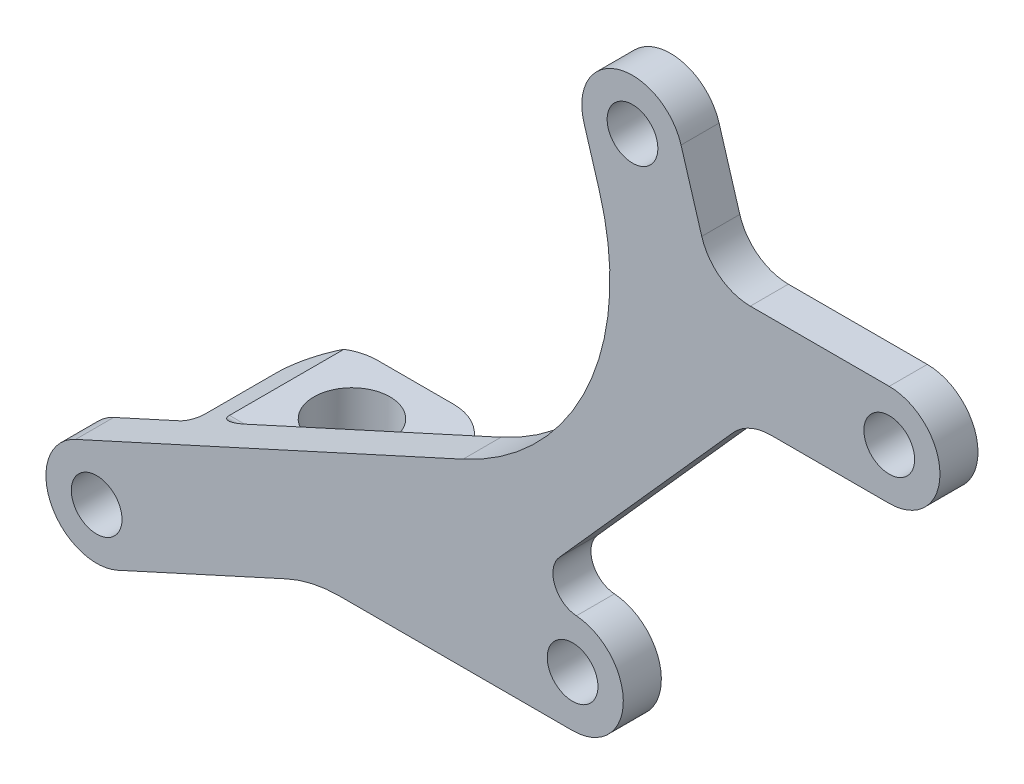
ISO-10303-21;
HEADER;
FILE_DESCRIPTION(('STEP AP214'),'2;1');
FILE_NAME('part.step','',(''),(''),'','','');
FILE_SCHEMA(('AUTOMOTIVE_DESIGN { 1 0 10303 214 1 1 1 1 }'));
ENDSEC;
DATA;
#1=APPLICATION_CONTEXT('core data for automotive mechanical design processes');
#2=APPLICATION_PROTOCOL_DEFINITION('international standard','automotive_design',2000,#1);
#3=PRODUCT_CONTEXT('',#1,'mechanical');
#4=PRODUCT('Part','Part','',(#3));
#5=PRODUCT_RELATED_PRODUCT_CATEGORY('part','',(#4));
#6=PRODUCT_DEFINITION_FORMATION('','',#4);
#7=PRODUCT_DEFINITION_CONTEXT('part definition',#1,'design');
#8=PRODUCT_DEFINITION('design','',#6,#7);
#9=PRODUCT_DEFINITION_SHAPE('','',#8);
#10=(LENGTH_UNIT() NAMED_UNIT(*) SI_UNIT(.MILLI.,.METRE.));
#11=(NAMED_UNIT(*) PLANE_ANGLE_UNIT() SI_UNIT($,.RADIAN.));
#12=(NAMED_UNIT(*) SI_UNIT($,.STERADIAN.) SOLID_ANGLE_UNIT());
#13=UNCERTAINTY_MEASURE_WITH_UNIT(LENGTH_MEASURE(1.E-05),#10,'distance_accuracy_value','');
#14=(GEOMETRIC_REPRESENTATION_CONTEXT(3) GLOBAL_UNCERTAINTY_ASSIGNED_CONTEXT((#13)) GLOBAL_UNIT_ASSIGNED_CONTEXT((#10,
#11,#12)) REPRESENTATION_CONTEXT('',''));
#15=CARTESIAN_POINT('',(0.,0.,0.));
#16=DIRECTION('',(0.,0.,1.));
#17=DIRECTION('',(1.,0.,0.));
#18=AXIS2_PLACEMENT_3D('',#15,#16,#17);
#19=CARTESIAN_POINT('',(15.9999999876103,2.00058899142973,0.));
#20=DIRECTION('',(0.,0.,1.));
#21=DIRECTION('',(1.,0.,0.));
#22=AXIS2_PLACEMENT_3D('',#19,#20,#21);
#23=PLANE('',#22);
#24=CARTESIAN_POINT('',(18.3627137863201,21.5612564415828,0.));
#25=DIRECTION('',(0.,0.,1.));
#26=DIRECTION('',(1.,0.,0.));
#27=AXIS2_PLACEMENT_3D('',#24,#25,#26);
#28=CIRCLE('',#27,1.);
#29=CARTESIAN_POINT('',(19.3627137863201,21.5612564415828,0.));
#30=VERTEX_POINT('',#29);
#31=EDGE_CURVE('E553',#30,#30,#28,.T.);
#32=ORIENTED_EDGE('',*,*,#31,.T.);
#33=EDGE_LOOP('',(#32));
#34=FACE_BOUND('',#33,.T.);
#35=CARTESIAN_POINT('',(15.9999999876103,2.00058899142973,0.));
#36=DIRECTION('',(0.,0.,1.));
#37=DIRECTION('',(1.,0.,0.));
#38=AXIS2_PLACEMENT_3D('',#35,#36,#37);
#39=CIRCLE('',#38,1.);
#40=CARTESIAN_POINT('',(16.9999999876103,2.00058899142973,0.));
#41=VERTEX_POINT('',#40);
#42=EDGE_CURVE('E557',#41,#41,#39,.T.);
#43=ORIENTED_EDGE('',*,*,#42,.T.);
#44=EDGE_LOOP('',(#43));
#45=FACE_BOUND('',#44,.T.);
#46=CARTESIAN_POINT('',(28.487225861294,16.0011779828595,0.));
#47=DIRECTION('',(0.,0.,1.));
#48=DIRECTION('',(1.,0.,0.));
#49=AXIS2_PLACEMENT_3D('',#46,#47,#48);
#50=CIRCLE('',#49,1.);
#51=CARTESIAN_POINT('',(29.487225861294,16.0011779828595,0.));
#52=VERTEX_POINT('',#51);
#53=EDGE_CURVE('E562',#52,#52,#50,.T.);
#54=ORIENTED_EDGE('',*,*,#53,.T.);
#55=EDGE_LOOP('',(#54));
#56=FACE_BOUND('',#55,.T.);
#57=DIRECTION('',(1.,0.,0.));
#58=VECTOR('',#57,1.);
#59=CARTESIAN_POINT('',(5.72587492170305,0.,0.));
#60=LINE('',#59,#58);
#61=CARTESIAN_POINT('',(8.49999998761032,0.,0.));
#62=VERTEX_POINT('',#61);
#63=CARTESIAN_POINT('',(15.9999999876103,0.,0.));
#64=VERTEX_POINT('',#63);
#65=EDGE_CURVE('E276',#62,#64,#60,.T.);
#66=ORIENTED_EDGE('',*,*,#65,.F.);
#67=DIRECTION('',(0.,-1.,0.));
#68=VECTOR('',#67,1.);
#69=CARTESIAN_POINT('',(8.49999998761032,2.5,0.));
#70=LINE('',#69,#68);
#71=CARTESIAN_POINT('',(8.49999998761032,2.5,0.));
#72=VERTEX_POINT('',#71);
#73=EDGE_CURVE('E354',#62,#72,#70,.F.);
#74=ORIENTED_EDGE('',*,*,#73,.T.);
#75=DIRECTION('',(1.,0.,0.));
#76=VECTOR('',#75,1.);
#77=CARTESIAN_POINT('',(0.468709119264436,2.5,0.));
#78=LINE('',#77,#76);
#79=CARTESIAN_POINT('',(1.56588374498278,2.5,0.));
#80=VERTEX_POINT('',#79);
#81=EDGE_CURVE('E339',#72,#80,#78,.F.);
#82=ORIENTED_EDGE('',*,*,#81,.T.);
#83=DIRECTION('',(-0.909964802315643,-0.414685493532933,0.));
#84=VECTOR('',#83,1.);
#85=CARTESIAN_POINT('',(-3.5973418353976,0.147035640748656,0.));
#86=LINE('',#85,#84);
#87=CARTESIAN_POINT('',(11.678911431911,7.10866823287454,0.));
#88=VERTEX_POINT('',#87);
#89=EDGE_CURVE('E281',#88,#80,#86,.T.);
#90=ORIENTED_EDGE('',*,*,#89,.F.);
#91=CARTESIAN_POINT('',(7.57352504593501,16.1173197757994,0.));
#92=DIRECTION('',(0.,0.,-1.));
#93=DIRECTION('',(1.,0.,0.));
#94=AXIS2_PLACEMENT_3D('',#91,#92,#93);
#95=CIRCLE('',#94,9.9);
#96=CARTESIAN_POINT('',(17.0539428486444,18.968929546801,0.));
#97=VERTEX_POINT('',#96);
#98=EDGE_CURVE('E508',#97,#88,#95,.T.);
#99=ORIENTED_EDGE('',*,*,#98,.F.);
#100=DIRECTION('',(0.288041391010258,-0.957617959869632,0.));
#101=VECTOR('',#100,1.);
#102=CARTESIAN_POINT('',(17.0539428486444,18.968929546801,0.));
#103=LINE('',#102,#101);
#104=CARTESIAN_POINT('',(16.4474778665809,20.9851736595623,0.));
#105=VERTEX_POINT('',#104);
#106=EDGE_CURVE('E506',#105,#97,#103,.T.);
#107=ORIENTED_EDGE('',*,*,#106,.F.);
#108=CARTESIAN_POINT('',(18.3627137863201,21.5612564415828,0.));
#109=DIRECTION('',(0.,0.,1.));
#110=DIRECTION('',(1.,0.,0.));
#111=AXIS2_PLACEMENT_3D('',#108,#109,#110);
#112=CIRCLE('',#111,2.);
#113=CARTESIAN_POINT('',(20.2779497060594,22.1373392236034,0.));
#114=VERTEX_POINT('',#113);
#115=EDGE_CURVE('E504',#114,#105,#112,.T.);
#116=ORIENTED_EDGE('',*,*,#115,.F.);
#117=DIRECTION('',(-0.288041391010258,0.957617959869632,0.));
#118=VECTOR('',#117,1.);
#119=CARTESIAN_POINT('',(20.2779497060594,22.1373392236034,0.));
#120=LINE('',#119,#118);
#121=CARTESIAN_POINT('',(21.093764126648,19.425095200839,0.));
#122=VERTEX_POINT('',#121);
#123=EDGE_CURVE('E502',#122,#114,#120,.T.);
#124=ORIENTED_EDGE('',*,*,#123,.F.);
#125=CARTESIAN_POINT('',(23.0090000463873,20.0011779828595,0.));
#126=DIRECTION('',(0.,0.,1.));
#127=DIRECTION('',(1.,0.,0.));
#128=AXIS2_PLACEMENT_3D('',#125,#126,#127);
#129=CIRCLE('',#128,2.);
#130=CARTESIAN_POINT('',(23.0090000463873,18.0011779828595,0.));
#131=VERTEX_POINT('',#130);
#132=EDGE_CURVE('E324',#122,#131,#129,.T.);
#133=ORIENTED_EDGE('',*,*,#132,.T.);
#134=DIRECTION('',(-1.,0.,0.));
#135=VECTOR('',#134,1.);
#136=CARTESIAN_POINT('',(28.487225861294,18.0011779828595,0.));
#137=LINE('',#136,#135);
#138=CARTESIAN_POINT('',(28.487225861294,18.0011779828595,0.));
#139=VERTEX_POINT('',#138);
#140=EDGE_CURVE('E499',#139,#131,#137,.T.);
#141=ORIENTED_EDGE('',*,*,#140,.F.);
#142=CARTESIAN_POINT('',(28.487225861294,16.0011779828595,0.));
#143=DIRECTION('',(0.,0.,1.));
#144=DIRECTION('',(1.,0.,0.));
#145=AXIS2_PLACEMENT_3D('',#142,#143,#144);
#146=CIRCLE('',#145,2.);
#147=CARTESIAN_POINT('',(28.487225861294,14.0011779828595,0.));
#148=VERTEX_POINT('',#147);
#149=EDGE_CURVE('E497',#148,#139,#146,.T.);
#150=ORIENTED_EDGE('',*,*,#149,.F.);
#151=DIRECTION('',(1.,0.,0.));
#152=VECTOR('',#151,1.);
#153=CARTESIAN_POINT('',(22.9190717043612,14.0011779828595,0.));
#154=LINE('',#153,#152);
#155=CARTESIAN_POINT('',(23.8151815342915,14.0011779828595,0.));
#156=VERTEX_POINT('',#155);
#157=EDGE_CURVE('E495',#156,#148,#154,.T.);
#158=ORIENTED_EDGE('',*,*,#157,.F.);
#159=CARTESIAN_POINT('',(23.8151815342915,12.0011779828595,0.));
#160=DIRECTION('',(0.,0.,1.));
#161=DIRECTION('',(1.,0.,0.));
#162=AXIS2_PLACEMENT_3D('',#159,#160,#161);
#163=CIRCLE('',#162,2.);
#164=CARTESIAN_POINT('',(22.3226020019824,13.3324203874319,0.));
#165=VERTEX_POINT('',#164);
#166=EDGE_CURVE('E319',#156,#165,#163,.T.);
#167=ORIENTED_EDGE('',*,*,#166,.T.);
#168=DIRECTION('',(0.66562120228622,0.746289766154572,0.));
#169=VECTOR('',#168,1.);
#170=CARTESIAN_POINT('',(13.9999998843631,4.00117798285946,0.));
#171=LINE('',#170,#169);
#172=CARTESIAN_POINT('',(15.4780865704061,5.65839828097267,0.));
#173=VERTEX_POINT('',#172);
#174=EDGE_CURVE('E492',#173,#165,#171,.T.);
#175=ORIENTED_EDGE('',*,*,#174,.F.);
#176=CARTESIAN_POINT('',(16.2243763365607,4.99277707868645,0.));
#177=DIRECTION('',(0.,0.,1.));
#178=DIRECTION('',(1.,0.,0.));
#179=AXIS2_PLACEMENT_3D('',#176,#177,#178);
#180=CIRCLE('',#179,1.);
#181=CARTESIAN_POINT('',(16.1495989013334,3.99557683040087,0.));
#182=VERTEX_POINT('',#181);
#183=EDGE_CURVE('E333',#173,#182,#180,.T.);
#184=ORIENTED_EDGE('',*,*,#183,.T.);
#185=CARTESIAN_POINT('',(15.9999999876103,2.00058899142973,0.));
#186=DIRECTION('',(0.,0.,1.));
#187=DIRECTION('',(1.,0.,0.));
#188=AXIS2_PLACEMENT_3D('',#185,#186,#187);
#189=CIRCLE('',#188,2.00058899142973);
#190=EDGE_CURVE('E489',#64,#182,#189,.T.);
#191=ORIENTED_EDGE('',*,*,#190,.F.);
#192=EDGE_LOOP('',(#66,#74,#82,#90,#99,#107,#116,#124,#133,#141,#150,#158,#167,#175,#184,#191));
#193=FACE_BOUND('',#192,.T.);
#194=ADVANCED_FACE('F33',(#34,#45,#56,#193),#23,.F.);
#195=CARTESIAN_POINT('',(-2.76797084833173,-1.67289396388264,0.));
#196=DIRECTION('',(0.,0.,1.));
#197=DIRECTION('',(1.,0.,0.));
#198=AXIS2_PLACEMENT_3D('',#195,#196,#197);
#199=CIRCLE('',#198,1.);
#200=CARTESIAN_POINT('',(-1.76797084833173,-1.67289396388264,0.));
#201=VERTEX_POINT('',#200);
#202=EDGE_CURVE('E568',#201,#201,#199,.T.);
#203=ORIENTED_EDGE('',*,*,#202,.T.);
#204=EDGE_LOOP('',(#203));
#205=FACE_BOUND('',#204,.T.);
#206=CARTESIAN_POINT('',(-1.00000001238968,1.33068579183896,0.));
#207=VERTEX_POINT('',#206);
#208=CARTESIAN_POINT('',(-3.5973418353976,0.147035640748653,0.));
#209=VERTEX_POINT('',#208);
#210=EDGE_CURVE('E509',#207,#209,#86,.T.);
#211=ORIENTED_EDGE('',*,*,#210,.F.);
#212=DIRECTION('',(0.,1.,0.));
#213=VECTOR('',#212,1.);
#214=CARTESIAN_POINT('',(-1.00000001238968,0.,0.));
#215=LINE('',#214,#213);
#216=CARTESIAN_POINT('',(-1.00000001238968,0.,0.));
#217=VERTEX_POINT('',#216);
#218=EDGE_CURVE('E344',#207,#217,#215,.F.);
#219=ORIENTED_EDGE('',*,*,#218,.T.);
#220=DIRECTION('',(-1.,0.,0.));
#221=VECTOR('',#220,1.);
#222=CARTESIAN_POINT('',(6.49999998761032,0.,0.));
#223=LINE('',#222,#221);
#224=CARTESIAN_POINT('',(6.81145904615961,0.,0.));
#225=VERTEX_POINT('',#224);
#226=EDGE_CURVE('E271',#225,#217,#223,.T.);
#227=ORIENTED_EDGE('',*,*,#226,.F.);
#228=CARTESIAN_POINT('',(6.81145904615961,-5.,0.));
#229=DIRECTION('',(0.,0.,1.));
#230=DIRECTION('',(1.,0.,0.));
#231=AXIS2_PLACEMENT_3D('',#228,#229,#230);
#232=CIRCLE('',#231,5.);
#233=CARTESIAN_POINT('',(4.73803157849494,-0.450175988421784,0.));
#234=VERTEX_POINT('',#233);
#235=EDGE_CURVE('E245',#225,#234,#232,.T.);
#236=ORIENTED_EDGE('',*,*,#235,.T.);
#237=DIRECTION('',(0.909964802315643,0.414685493532933,0.));
#238=VECTOR('',#237,1.);
#239=CARTESIAN_POINT('',(-1.93859986126587,-3.49282356851392,0.));
#240=LINE('',#239,#238);
#241=CARTESIAN_POINT('',(-1.93859986126587,-3.49282356851392,0.));
#242=VERTEX_POINT('',#241);
#243=EDGE_CURVE('E269',#242,#234,#240,.T.);
#244=ORIENTED_EDGE('',*,*,#243,.F.);
#245=CARTESIAN_POINT('',(-2.76797084833173,-1.67289396388264,0.));
#246=DIRECTION('',(0.,0.,1.));
#247=DIRECTION('',(1.,0.,0.));
#248=AXIS2_PLACEMENT_3D('',#245,#246,#247);
#249=CIRCLE('',#248,2.);
#250=EDGE_CURVE('E277',#209,#242,#249,.T.);
#251=ORIENTED_EDGE('',*,*,#250,.F.);
#252=EDGE_LOOP('',(#211,#219,#227,#236,#244,#251));
#253=FACE_BOUND('',#252,.T.);
#254=ADVANCED_FACE('F267',(#205,#253),#23,.F.);
#255=CARTESIAN_POINT('',(15.9999999876103,2.00058899142973,1.5));
#256=DIRECTION('',(0.,0.,1.));
#257=DIRECTION('',(1.,0.,0.));
#258=AXIS2_PLACEMENT_3D('',#255,#256,#257);
#259=PLANE('',#258);
#260=CARTESIAN_POINT('',(15.9999999876103,2.00058899142973,1.5));
#261=DIRECTION('',(0.,0.,1.));
#262=DIRECTION('',(1.,0.,0.));
#263=AXIS2_PLACEMENT_3D('',#260,#261,#262);
#264=CIRCLE('',#263,1.);
#265=CARTESIAN_POINT('',(16.9999999876103,2.00058899142973,1.5));
#266=VERTEX_POINT('',#265);
#267=EDGE_CURVE('E559',#266,#266,#264,.T.);
#268=ORIENTED_EDGE('',*,*,#267,.F.);
#269=EDGE_LOOP('',(#268));
#270=FACE_BOUND('',#269,.T.);
#271=CARTESIAN_POINT('',(-2.76797084833173,-1.67289396388264,1.5));
#272=DIRECTION('',(0.,0.,1.));
#273=DIRECTION('',(1.,0.,0.));
#274=AXIS2_PLACEMENT_3D('',#271,#272,#273);
#275=CIRCLE('',#274,1.);
#276=CARTESIAN_POINT('',(-1.76797084833173,-1.67289396388264,1.5));
#277=VERTEX_POINT('',#276);
#278=EDGE_CURVE('E493',#277,#277,#275,.T.);
#279=ORIENTED_EDGE('',*,*,#278,.F.);
#280=EDGE_LOOP('',(#279));
#281=FACE_BOUND('',#280,.T.);
#282=CARTESIAN_POINT('',(15.9999999876103,2.00058899142973,1.5));
#283=DIRECTION('',(0.,0.,1.));
#284=DIRECTION('',(1.,0.,0.));
#285=AXIS2_PLACEMENT_3D('',#282,#283,#284);
#286=CIRCLE('',#285,2.00058899142973);
#287=CARTESIAN_POINT('',(15.9999999876103,0.,1.5));
#288=VERTEX_POINT('',#287);
#289=CARTESIAN_POINT('',(16.1495989013334,3.99557683040087,1.5));
#290=VERTEX_POINT('',#289);
#291=EDGE_CURVE('E279',#288,#290,#286,.T.);
#292=ORIENTED_EDGE('',*,*,#291,.T.);
#293=CARTESIAN_POINT('',(16.2243763365607,4.99277707868645,1.5));
#294=DIRECTION('',(0.,0.,1.));
#295=DIRECTION('',(1.,0.,0.));
#296=AXIS2_PLACEMENT_3D('',#293,#294,#295);
#297=CIRCLE('',#296,1.);
#298=CARTESIAN_POINT('',(15.4780865704061,5.65839828097267,1.5));
#299=VERTEX_POINT('',#298);
#300=EDGE_CURVE('E335',#290,#299,#297,.F.);
#301=ORIENTED_EDGE('',*,*,#300,.T.);
#302=DIRECTION('',(0.66562120228622,0.746289766154572,0.));
#303=VECTOR('',#302,1.);
#304=CARTESIAN_POINT('',(13.9999998843631,4.00117798285946,1.5));
#305=LINE('',#304,#303);
#306=CARTESIAN_POINT('',(22.3226020019824,13.3324203874319,1.5));
#307=VERTEX_POINT('',#306);
#308=EDGE_CURVE('E576',#299,#307,#305,.T.);
#309=ORIENTED_EDGE('',*,*,#308,.T.);
#310=CARTESIAN_POINT('',(23.8151815342915,12.0011779828595,1.5));
#311=DIRECTION('',(0.,0.,1.));
#312=DIRECTION('',(1.,0.,0.));
#313=AXIS2_PLACEMENT_3D('',#310,#311,#312);
#314=CIRCLE('',#313,2.);
#315=CARTESIAN_POINT('',(23.8151815342915,14.0011779828595,1.5));
#316=VERTEX_POINT('',#315);
#317=EDGE_CURVE('E322',#307,#316,#314,.F.);
#318=ORIENTED_EDGE('',*,*,#317,.T.);
#319=DIRECTION('',(1.,0.,0.));
#320=VECTOR('',#319,1.);
#321=CARTESIAN_POINT('',(22.9190717043612,14.0011779828595,1.5));
#322=LINE('',#321,#320);
#323=CARTESIAN_POINT('',(28.487225861294,14.0011779828595,1.5));
#324=VERTEX_POINT('',#323);
#325=EDGE_CURVE('E578',#316,#324,#322,.T.);
#326=ORIENTED_EDGE('',*,*,#325,.T.);
#327=CARTESIAN_POINT('',(28.487225861294,16.0011779828595,1.5));
#328=DIRECTION('',(0.,0.,1.));
#329=DIRECTION('',(1.,0.,0.));
#330=AXIS2_PLACEMENT_3D('',#327,#328,#329);
#331=CIRCLE('',#330,2.);
#332=CARTESIAN_POINT('',(28.487225861294,18.0011779828595,1.5));
#333=VERTEX_POINT('',#332);
#334=EDGE_CURVE('E477',#324,#333,#331,.T.);
#335=ORIENTED_EDGE('',*,*,#334,.T.);
#336=DIRECTION('',(-1.,0.,0.));
#337=VECTOR('',#336,1.);
#338=CARTESIAN_POINT('',(28.487225861294,18.0011779828595,1.5));
#339=LINE('',#338,#337);
#340=CARTESIAN_POINT('',(23.0090000463873,18.0011779828595,1.5));
#341=VERTEX_POINT('',#340);
#342=EDGE_CURVE('E470',#333,#341,#339,.T.);
#343=ORIENTED_EDGE('',*,*,#342,.T.);
#344=CARTESIAN_POINT('',(23.0090000463873,20.0011779828595,1.5));
#345=DIRECTION('',(0.,0.,1.));
#346=DIRECTION('',(1.,0.,0.));
#347=AXIS2_PLACEMENT_3D('',#344,#345,#346);
#348=CIRCLE('',#347,2.);
#349=CARTESIAN_POINT('',(21.093764126648,19.425095200839,1.5));
#350=VERTEX_POINT('',#349);
#351=EDGE_CURVE('E326',#341,#350,#348,.F.);
#352=ORIENTED_EDGE('',*,*,#351,.T.);
#353=DIRECTION('',(-0.288041391010258,0.957617959869632,0.));
#354=VECTOR('',#353,1.);
#355=CARTESIAN_POINT('',(20.2779497060594,22.1373392236034,1.5));
#356=LINE('',#355,#354);
#357=CARTESIAN_POINT('',(20.2779497060594,22.1373392236034,1.5));
#358=VERTEX_POINT('',#357);
#359=EDGE_CURVE('E467',#350,#358,#356,.T.);
#360=ORIENTED_EDGE('',*,*,#359,.T.);
#361=CARTESIAN_POINT('',(18.3627137863201,21.5612564415828,1.5));
#362=DIRECTION('',(0.,0.,1.));
#363=DIRECTION('',(1.,0.,0.));
#364=AXIS2_PLACEMENT_3D('',#361,#362,#363);
#365=CIRCLE('',#364,2.);
#366=CARTESIAN_POINT('',(16.4474778665809,20.9851736595623,1.5));
#367=VERTEX_POINT('',#366);
#368=EDGE_CURVE('E473',#358,#367,#365,.T.);
#369=ORIENTED_EDGE('',*,*,#368,.T.);
#370=DIRECTION('',(0.288041391010258,-0.957617959869632,0.));
#371=VECTOR('',#370,1.);
#372=CARTESIAN_POINT('',(17.0539428486444,18.968929546801,1.5));
#373=LINE('',#372,#371);
#374=CARTESIAN_POINT('',(17.0539428486444,18.968929546801,1.5));
#375=VERTEX_POINT('',#374);
#376=EDGE_CURVE('E475',#367,#375,#373,.T.);
#377=ORIENTED_EDGE('',*,*,#376,.T.);
#378=CARTESIAN_POINT('',(7.57352504593501,16.1173197757994,1.5));
#379=DIRECTION('',(0.,0.,-1.));
#380=DIRECTION('',(1.,0.,0.));
#381=AXIS2_PLACEMENT_3D('',#378,#379,#380);
#382=CIRCLE('',#381,9.9);
#383=CARTESIAN_POINT('',(11.678911431911,7.10866823287454,1.5));
#384=VERTEX_POINT('',#383);
#385=EDGE_CURVE('E482',#375,#384,#382,.T.);
#386=ORIENTED_EDGE('',*,*,#385,.T.);
#387=DIRECTION('',(-0.909964802315643,-0.414685493532933,0.));
#388=VECTOR('',#387,1.);
#389=CARTESIAN_POINT('',(-3.5973418353976,0.147035640748656,1.5));
#390=LINE('',#389,#388);
#391=CARTESIAN_POINT('',(-3.5973418353976,0.147035640748653,1.5));
#392=VERTEX_POINT('',#391);
#393=EDGE_CURVE('E484',#384,#392,#390,.T.);
#394=ORIENTED_EDGE('',*,*,#393,.T.);
#395=CARTESIAN_POINT('',(-2.76797084833173,-1.67289396388264,1.5));
#396=DIRECTION('',(0.,0.,1.));
#397=DIRECTION('',(1.,0.,0.));
#398=AXIS2_PLACEMENT_3D('',#395,#396,#397);
#399=CIRCLE('',#398,2.);
#400=CARTESIAN_POINT('',(-1.93859986126587,-3.49282356851392,1.5));
#401=VERTEX_POINT('',#400);
#402=EDGE_CURVE('E486',#392,#401,#399,.T.);
#403=ORIENTED_EDGE('',*,*,#402,.T.);
#404=DIRECTION('',(0.909964802315643,0.414685493532933,0.));
#405=VECTOR('',#404,1.);
#406=CARTESIAN_POINT('',(-1.93859986126587,-3.49282356851392,1.5));
#407=LINE('',#406,#405);
#408=CARTESIAN_POINT('',(4.73803157849494,-0.450175988421784,1.5));
#409=VERTEX_POINT('',#408);
#410=EDGE_CURVE('E254',#401,#409,#407,.T.);
#411=ORIENTED_EDGE('',*,*,#410,.T.);
#412=CARTESIAN_POINT('',(6.81145904615961,-5.,1.5));
#413=DIRECTION('',(0.,0.,1.));
#414=DIRECTION('',(1.,0.,0.));
#415=AXIS2_PLACEMENT_3D('',#412,#413,#414);
#416=CIRCLE('',#415,5.);
#417=CARTESIAN_POINT('',(6.81145904615961,0.,1.5));
#418=VERTEX_POINT('',#417);
#419=EDGE_CURVE('E41',#409,#418,#416,.F.);
#420=ORIENTED_EDGE('',*,*,#419,.T.);
#421=DIRECTION('',(1.,0.,0.));
#422=VECTOR('',#421,1.);
#423=CARTESIAN_POINT('',(5.72587492170305,0.,1.5));
#424=LINE('',#423,#422);
#425=EDGE_CURVE('E252',#418,#288,#424,.T.);
#426=ORIENTED_EDGE('',*,*,#425,.T.);
#427=EDGE_LOOP('',(#292,#301,#309,#318,#326,#335,#343,#352,#360,#369,#377,#386,#394,#403,#411,
#420,#426));
#428=FACE_BOUND('',#427,.T.);
#429=CARTESIAN_POINT('',(28.487225861294,16.0011779828595,1.5));
#430=DIRECTION('',(0.,0.,1.));
#431=DIRECTION('',(1.,0.,0.));
#432=AXIS2_PLACEMENT_3D('',#429,#430,#431);
#433=CIRCLE('',#432,1.);
#434=CARTESIAN_POINT('',(29.487225861294,16.0011779828595,1.5));
#435=VERTEX_POINT('',#434);
#436=EDGE_CURVE('E565',#435,#435,#433,.T.);
#437=ORIENTED_EDGE('',*,*,#436,.F.);
#438=EDGE_LOOP('',(#437));
#439=FACE_BOUND('',#438,.T.);
#440=CARTESIAN_POINT('',(18.3627137863201,21.5612564415828,1.5));
#441=DIRECTION('',(0.,0.,1.));
#442=DIRECTION('',(1.,0.,0.));
#443=AXIS2_PLACEMENT_3D('',#440,#441,#442);
#444=CIRCLE('',#443,1.);
#445=CARTESIAN_POINT('',(19.3627137863201,21.5612564415828,1.5));
#446=VERTEX_POINT('',#445);
#447=EDGE_CURVE('E554',#446,#446,#444,.T.);
#448=ORIENTED_EDGE('',*,*,#447,.F.);
#449=EDGE_LOOP('',(#448));
#450=FACE_BOUND('',#449,.T.);
#451=ADVANCED_FACE('F250',(#270,#281,#428,#439,#450),#259,.T.);
#452=CARTESIAN_POINT('',(15.9999999876103,2.00058899142973,1.5));
#453=DIRECTION('',(0.,0.,-1.));
#454=DIRECTION('',(-1.,0.,0.));
#455=AXIS2_PLACEMENT_3D('',#452,#453,#454);
#456=CYLINDRICAL_SURFACE('',#455,2.00058899142973);
#457=ORIENTED_EDGE('',*,*,#190,.T.);
#458=DIRECTION('',(0.,0.,-1.));
#459=VECTOR('',#458,1.);
#460=CARTESIAN_POINT('',(16.1495989013334,3.99557683040087,1.5));
#461=LINE('',#460,#459);
#462=EDGE_CURVE('E331',#182,#290,#461,.F.);
#463=ORIENTED_EDGE('',*,*,#462,.T.);
#464=ORIENTED_EDGE('',*,*,#291,.F.);
#465=DIRECTION('',(0.,0.,-1.));
#466=VECTOR('',#465,1.);
#467=CARTESIAN_POINT('',(15.9999999876103,0.,1.5));
#468=LINE('',#467,#466);
#469=EDGE_CURVE('E260',#288,#64,#468,.T.);
#470=ORIENTED_EDGE('',*,*,#469,.T.);
#471=EDGE_LOOP('',(#457,#463,#464,#470));
#472=FACE_BOUND('',#471,.T.);
#473=ADVANCED_FACE('F445',(#472),#456,.T.);
#474=CARTESIAN_POINT('',(13.9999998843631,4.00117798285946,1.5));
#475=DIRECTION('',(-0.746289766154572,0.66562120228622,0.));
#476=DIRECTION('',(-0.66562120228622,-0.746289766154572,0.));
#477=AXIS2_PLACEMENT_3D('',#474,#475,#476);
#478=PLANE('',#477);
#479=ORIENTED_EDGE('',*,*,#308,.F.);
#480=DIRECTION('',(0.,0.,1.));
#481=VECTOR('',#480,1.);
#482=CARTESIAN_POINT('',(15.4780865704061,5.65839828097267,0.));
#483=LINE('',#482,#481);
#484=EDGE_CURVE('E328',#299,#173,#483,.F.);
#485=ORIENTED_EDGE('',*,*,#484,.T.);
#486=ORIENTED_EDGE('',*,*,#174,.T.);
#487=DIRECTION('',(0.,0.,-1.));
#488=VECTOR('',#487,1.);
#489=CARTESIAN_POINT('',(22.3226020019824,13.3324203874319,1.5));
#490=LINE('',#489,#488);
#491=EDGE_CURVE('E311',#165,#307,#490,.F.);
#492=ORIENTED_EDGE('',*,*,#491,.T.);
#493=EDGE_LOOP('',(#479,#485,#486,#492));
#494=FACE_BOUND('',#493,.T.);
#495=ADVANCED_FACE('F441',(#494),#478,.F.);
#496=CARTESIAN_POINT('',(22.9190717043612,14.0011779828595,1.5));
#497=DIRECTION('',(0.,1.,0.));
#498=DIRECTION('',(0.,0.,1.));
#499=AXIS2_PLACEMENT_3D('',#496,#497,#498);
#500=PLANE('',#499);
#501=ORIENTED_EDGE('',*,*,#325,.F.);
#502=DIRECTION('',(0.,0.,-1.));
#503=VECTOR('',#502,1.);
#504=CARTESIAN_POINT('',(23.8151815342915,14.0011779828595,0.));
#505=LINE('',#504,#503);
#506=EDGE_CURVE('E308',#316,#156,#505,.T.);
#507=ORIENTED_EDGE('',*,*,#506,.T.);
#508=ORIENTED_EDGE('',*,*,#157,.T.);
#509=DIRECTION('',(0.,0.,-1.));
#510=VECTOR('',#509,1.);
#511=CARTESIAN_POINT('',(28.487225861294,14.0011779828595,1.5));
#512=LINE('',#511,#510);
#513=EDGE_CURVE('E305',#324,#148,#512,.T.);
#514=ORIENTED_EDGE('',*,*,#513,.F.);
#515=EDGE_LOOP('',(#501,#507,#508,#514));
#516=FACE_BOUND('',#515,.T.);
#517=ADVANCED_FACE('F437',(#516),#500,.F.);
#518=CARTESIAN_POINT('',(28.487225861294,16.0011779828595,1.5));
#519=DIRECTION('',(0.,0.,-1.));
#520=DIRECTION('',(-1.,0.,0.));
#521=AXIS2_PLACEMENT_3D('',#518,#519,#520);
#522=CYLINDRICAL_SURFACE('',#521,2.);
#523=ORIENTED_EDGE('',*,*,#149,.T.);
#524=DIRECTION('',(0.,0.,-1.));
#525=VECTOR('',#524,1.);
#526=CARTESIAN_POINT('',(28.487225861294,18.0011779828595,1.5));
#527=LINE('',#526,#525);
#528=EDGE_CURVE('E302',#333,#139,#527,.T.);
#529=ORIENTED_EDGE('',*,*,#528,.F.);
#530=ORIENTED_EDGE('',*,*,#334,.F.);
#531=ORIENTED_EDGE('',*,*,#513,.T.);
#532=EDGE_LOOP('',(#523,#529,#530,#531));
#533=FACE_BOUND('',#532,.T.);
#534=ADVANCED_FACE('F433',(#533),#522,.T.);
#535=CARTESIAN_POINT('',(28.487225861294,18.0011779828595,1.5));
#536=DIRECTION('',(0.,-1.,0.));
#537=DIRECTION('',(0.,0.,-1.));
#538=AXIS2_PLACEMENT_3D('',#535,#536,#537);
#539=PLANE('',#538);
#540=ORIENTED_EDGE('',*,*,#140,.T.);
#541=DIRECTION('',(0.,0.,-1.));
#542=VECTOR('',#541,1.);
#543=CARTESIAN_POINT('',(23.0090000463873,18.0011779828595,1.5));
#544=LINE('',#543,#542);
#545=EDGE_CURVE('E317',#131,#341,#544,.F.);
#546=ORIENTED_EDGE('',*,*,#545,.T.);
#547=ORIENTED_EDGE('',*,*,#342,.F.);
#548=ORIENTED_EDGE('',*,*,#528,.T.);
#549=EDGE_LOOP('',(#540,#546,#547,#548));
#550=FACE_BOUND('',#549,.T.);
#551=ADVANCED_FACE('F429',(#550),#539,.F.);
#552=CARTESIAN_POINT('',(20.2779497060594,22.1373392236034,1.5));
#553=DIRECTION('',(-0.957617959869632,-0.288041391010258,0.));
#554=DIRECTION('',(0.288041391010258,-0.957617959869632,0.));
#555=AXIS2_PLACEMENT_3D('',#552,#553,#554);
#556=PLANE('',#555);
#557=ORIENTED_EDGE('',*,*,#359,.F.);
#558=DIRECTION('',(0.,0.,-1.));
#559=VECTOR('',#558,1.);
#560=CARTESIAN_POINT('',(21.093764126648,19.425095200839,0.));
#561=LINE('',#560,#559);
#562=EDGE_CURVE('E314',#350,#122,#561,.T.);
#563=ORIENTED_EDGE('',*,*,#562,.T.);
#564=ORIENTED_EDGE('',*,*,#123,.T.);
#565=DIRECTION('',(0.,0.,-1.));
#566=VECTOR('',#565,1.);
#567=CARTESIAN_POINT('',(20.2779497060594,22.1373392236034,1.5));
#568=LINE('',#567,#566);
#569=EDGE_CURVE('E299',#358,#114,#568,.T.);
#570=ORIENTED_EDGE('',*,*,#569,.F.);
#571=EDGE_LOOP('',(#557,#563,#564,#570));
#572=FACE_BOUND('',#571,.T.);
#573=ADVANCED_FACE('F425',(#572),#556,.F.);
#574=CARTESIAN_POINT('',(18.3627137863201,21.5612564415828,1.5));
#575=DIRECTION('',(0.,0.,-1.));
#576=DIRECTION('',(-1.,0.,0.));
#577=AXIS2_PLACEMENT_3D('',#574,#575,#576);
#578=CYLINDRICAL_SURFACE('',#577,2.);
#579=ORIENTED_EDGE('',*,*,#115,.T.);
#580=DIRECTION('',(0.,0.,-1.));
#581=VECTOR('',#580,1.);
#582=CARTESIAN_POINT('',(16.4474778665809,20.9851736595623,1.5));
#583=LINE('',#582,#581);
#584=EDGE_CURVE('E296',#367,#105,#583,.T.);
#585=ORIENTED_EDGE('',*,*,#584,.F.);
#586=ORIENTED_EDGE('',*,*,#368,.F.);
#587=ORIENTED_EDGE('',*,*,#569,.T.);
#588=EDGE_LOOP('',(#579,#585,#586,#587));
#589=FACE_BOUND('',#588,.T.);
#590=ADVANCED_FACE('F421',(#589),#578,.T.);
#591=CARTESIAN_POINT('',(17.0539428486444,18.968929546801,1.5));
#592=DIRECTION('',(0.957617959869632,0.288041391010258,0.));
#593=DIRECTION('',(-0.288041391010258,0.957617959869632,0.));
#594=AXIS2_PLACEMENT_3D('',#591,#592,#593);
#595=PLANE('',#594);
#596=ORIENTED_EDGE('',*,*,#106,.T.);
#597=DIRECTION('',(0.,0.,-1.));
#598=VECTOR('',#597,1.);
#599=CARTESIAN_POINT('',(17.0539428486444,18.968929546801,1.5));
#600=LINE('',#599,#598);
#601=EDGE_CURVE('E293',#375,#97,#600,.T.);
#602=ORIENTED_EDGE('',*,*,#601,.F.);
#603=ORIENTED_EDGE('',*,*,#376,.F.);
#604=ORIENTED_EDGE('',*,*,#584,.T.);
#605=EDGE_LOOP('',(#596,#602,#603,#604));
#606=FACE_BOUND('',#605,.T.);
#607=ADVANCED_FACE('F417',(#606),#595,.F.);
#608=CARTESIAN_POINT('',(7.57352504593501,16.1173197757994,1.5));
#609=DIRECTION('',(0.,0.,-1.));
#610=DIRECTION('',(-1.,0.,0.));
#611=AXIS2_PLACEMENT_3D('',#608,#609,#610);
#612=CYLINDRICAL_SURFACE('',#611,9.9);
#613=ORIENTED_EDGE('',*,*,#98,.T.);
#614=DIRECTION('',(0.,0.,-1.));
#615=VECTOR('',#614,1.);
#616=CARTESIAN_POINT('',(11.678911431911,7.10866823287454,1.5));
#617=LINE('',#616,#615);
#618=EDGE_CURVE('E290',#384,#88,#617,.T.);
#619=ORIENTED_EDGE('',*,*,#618,.F.);
#620=ORIENTED_EDGE('',*,*,#385,.F.);
#621=ORIENTED_EDGE('',*,*,#601,.T.);
#622=EDGE_LOOP('',(#613,#619,#620,#621));
#623=FACE_BOUND('',#622,.T.);
#624=ADVANCED_FACE('F414',(#623),#612,.F.);
#625=CARTESIAN_POINT('',(-3.5973418353976,0.147035640748656,1.5));
#626=DIRECTION('',(0.414685493532933,-0.909964802315643,0.));
#627=DIRECTION('',(0.909964802315643,0.414685493532933,0.));
#628=AXIS2_PLACEMENT_3D('',#625,#626,#627);
#629=PLANE('',#628);
#630=ORIENTED_EDGE('',*,*,#89,.T.);
#631=CARTESIAN_POINT('',(1.56588374498278,2.5,-0.5));
#632=DIRECTION('',(0.414685493532933,-0.909964802315643,0.));
#633=DIRECTION('',(-0.909964802315643,-0.414685493532933,0.));
#634=AXIS2_PLACEMENT_3D('',#631,#632,#633);
#635=ELLIPSE('',#634,1.205733038164,0.5);
#636=CARTESIAN_POINT('',(0.468709119264437,2.,-0.5));
#637=VERTEX_POINT('',#636);
#638=EDGE_CURVE('E341',#80,#637,#635,.T.);
#639=ORIENTED_EDGE('',*,*,#638,.T.);
#640=DIRECTION('',(0.,0.,1.));
#641=VECTOR('',#640,1.);
#642=CARTESIAN_POINT('',(0.468709119264436,2.,-6.));
#643=LINE('',#642,#641);
#644=CARTESIAN_POINT('',(0.468709119264437,2.,-5.01360413890326));
#645=VERTEX_POINT('',#644);
#646=EDGE_CURVE('E47',#645,#637,#643,.T.);
#647=ORIENTED_EDGE('',*,*,#646,.F.);
#648=CARTESIAN_POINT('',(1.49999998761032,2.46997571953083,-3.3));
#649=DIRECTION('',(0.414685493532933,-0.909964802315643,0.));
#650=DIRECTION('',(0.909964802315643,0.414685493532933,0.));
#651=AXIS2_PLACEMENT_3D('',#648,#649,#650);
#652=ELLIPSE('',#651,2.19788720938489,2.);
#653=CARTESIAN_POINT('',(-0.500000012389676,1.55854377737733,-3.3));
#654=VERTEX_POINT('',#653);
#655=EDGE_CURVE('E11',#645,#654,#652,.F.);
#656=ORIENTED_EDGE('',*,*,#655,.T.);
#657=DIRECTION('',(0.,0.,1.));
#658=VECTOR('',#657,1.);
#659=CARTESIAN_POINT('',(-0.500000012389676,1.55854377737733,-6.));
#660=LINE('',#659,#658);
#661=CARTESIAN_POINT('',(-0.500000012389676,1.55854377737733,-0.5));
#662=VERTEX_POINT('',#661);
#663=EDGE_CURVE('E213',#654,#662,#660,.T.);
#664=ORIENTED_EDGE('',*,*,#663,.T.);
#665=CARTESIAN_POINT('',(-1.00000001238968,1.33068579183896,-0.5));
#666=DIRECTION('',(0.414685493532933,-0.909964802315643,0.));
#667=DIRECTION('',(-0.909964802315643,-0.414685493532933,0.));
#668=AXIS2_PLACEMENT_3D('',#665,#666,#667);
#669=ELLIPSE('',#668,0.549471802346222,0.5);
#670=EDGE_CURVE('E346',#662,#207,#669,.T.);
#671=ORIENTED_EDGE('',*,*,#670,.T.);
#672=ORIENTED_EDGE('',*,*,#210,.T.);
#673=DIRECTION('',(0.,0.,-1.));
#674=VECTOR('',#673,1.);
#675=CARTESIAN_POINT('',(-3.5973418353976,0.147035640748653,1.5));
#676=LINE('',#675,#674);
#677=EDGE_CURVE('E287',#392,#209,#676,.T.);
#678=ORIENTED_EDGE('',*,*,#677,.F.);
#679=ORIENTED_EDGE('',*,*,#393,.F.);
#680=ORIENTED_EDGE('',*,*,#618,.T.);
#681=EDGE_LOOP('',(#630,#639,#647,#656,#664,#671,#672,#678,#679,#680));
#682=FACE_BOUND('',#681,.T.);
#683=ADVANCED_FACE('F212',(#682),#629,.F.);
#684=CARTESIAN_POINT('',(-2.76797084833173,-1.67289396388264,1.5));
#685=DIRECTION('',(0.,0.,-1.));
#686=DIRECTION('',(-1.,0.,0.));
#687=AXIS2_PLACEMENT_3D('',#684,#685,#686);
#688=CYLINDRICAL_SURFACE('',#687,2.);
#689=ORIENTED_EDGE('',*,*,#250,.T.);
#690=DIRECTION('',(0.,0.,-1.));
#691=VECTOR('',#690,1.);
#692=CARTESIAN_POINT('',(-1.93859986126587,-3.49282356851392,1.5));
#693=LINE('',#692,#691);
#694=EDGE_CURVE('E275',#401,#242,#693,.T.);
#695=ORIENTED_EDGE('',*,*,#694,.F.);
#696=ORIENTED_EDGE('',*,*,#402,.F.);
#697=ORIENTED_EDGE('',*,*,#677,.T.);
#698=EDGE_LOOP('',(#689,#695,#696,#697));
#699=FACE_BOUND('',#698,.T.);
#700=ADVANCED_FACE('F408',(#699),#688,.T.);
#701=CARTESIAN_POINT('',(-1.93859986126587,-3.49282356851392,1.5));
#702=DIRECTION('',(-0.414685493532933,0.909964802315643,0.));
#703=DIRECTION('',(-0.909964802315643,-0.414685493532933,0.));
#704=AXIS2_PLACEMENT_3D('',#701,#702,#703);
#705=PLANE('',#704);
#706=ORIENTED_EDGE('',*,*,#243,.T.);
#707=DIRECTION('',(0.,0.,-1.));
#708=VECTOR('',#707,1.);
#709=CARTESIAN_POINT('',(4.73803157849494,-0.450175988421783,1.5));
#710=LINE('',#709,#708);
#711=EDGE_CURVE('E55',#234,#409,#710,.F.);
#712=ORIENTED_EDGE('',*,*,#711,.T.);
#713=ORIENTED_EDGE('',*,*,#410,.F.);
#714=ORIENTED_EDGE('',*,*,#694,.T.);
#715=EDGE_LOOP('',(#706,#712,#713,#714));
#716=FACE_BOUND('',#715,.T.);
#717=ADVANCED_FACE('F273',(#716),#705,.F.);
#718=CARTESIAN_POINT('',(5.72587492170305,0.,1.5));
#719=DIRECTION('',(0.,1.,0.));
#720=DIRECTION('',(-1.,0.,0.));
#721=AXIS2_PLACEMENT_3D('',#718,#719,#720);
#722=PLANE('',#721);
#723=CARTESIAN_POINT('',(2.99999998761032,0.,-2.8));
#724=DIRECTION('',(0.,1.,0.));
#725=DIRECTION('',(-1.,0.,0.));
#726=AXIS2_PLACEMENT_3D('',#723,#724,#725);
#727=CIRCLE('',#726,1.5);
#728=CARTESIAN_POINT('',(1.49999998761032,0.,-2.8));
#729=VERTEX_POINT('',#728);
#730=EDGE_CURVE('E535',#729,#729,#727,.T.);
#731=ORIENTED_EDGE('',*,*,#730,.T.);
#732=EDGE_LOOP('',(#731));
#733=FACE_BOUND('',#732,.T.);
#734=ORIENTED_EDGE('',*,*,#425,.F.);
#735=DIRECTION('',(0.,0.,-1.));
#736=VECTOR('',#735,1.);
#737=CARTESIAN_POINT('',(6.81145904615961,0.,0.));
#738=LINE('',#737,#736);
#739=EDGE_CURVE('E241',#418,#225,#738,.T.);
#740=ORIENTED_EDGE('',*,*,#739,.T.);
#741=ORIENTED_EDGE('',*,*,#226,.T.);
#742=CARTESIAN_POINT('',(-1.00000001238968,0.,-0.5));
#743=DIRECTION('',(0.,1.,0.));
#744=DIRECTION('',(-1.,0.,0.));
#745=AXIS2_PLACEMENT_3D('',#742,#743,#744);
#746=CIRCLE('',#745,0.5);
#747=CARTESIAN_POINT('',(-0.500000012389676,0.,-0.5));
#748=VERTEX_POINT('',#747);
#749=EDGE_CURVE('E348',#217,#748,#746,.T.);
#750=ORIENTED_EDGE('',*,*,#749,.T.);
#751=DIRECTION('',(0.,0.,1.));
#752=VECTOR('',#751,1.);
#753=CARTESIAN_POINT('',(-0.500000012389676,0.,-5.3));
#754=LINE('',#753,#752);
#755=CARTESIAN_POINT('',(-0.500000012389676,0.,-3.3));
#756=VERTEX_POINT('',#755);
#757=EDGE_CURVE('E549',#756,#748,#754,.T.);
#758=ORIENTED_EDGE('',*,*,#757,.F.);
#759=CARTESIAN_POINT('',(1.49999998761032,0.,-3.3));
#760=DIRECTION('',(0.,1.,0.));
#761=DIRECTION('',(-1.,0.,0.));
#762=AXIS2_PLACEMENT_3D('',#759,#760,#761);
#763=CIRCLE('',#762,2.);
#764=CARTESIAN_POINT('',(1.49999998761032,0.,-5.3));
#765=VERTEX_POINT('',#764);
#766=EDGE_CURVE('E229',#756,#765,#763,.F.);
#767=ORIENTED_EDGE('',*,*,#766,.T.);
#768=DIRECTION('',(-1.,0.,0.));
#769=VECTOR('',#768,1.);
#770=CARTESIAN_POINT('',(6.49999998761032,0.,-5.3));
#771=LINE('',#770,#769);
#772=CARTESIAN_POINT('',(4.49999998761032,0.,-5.3));
#773=VERTEX_POINT('',#772);
#774=EDGE_CURVE('E540',#773,#765,#771,.T.);
#775=ORIENTED_EDGE('',*,*,#774,.F.);
#776=CARTESIAN_POINT('',(4.49999998761032,0.,-3.3));
#777=DIRECTION('',(0.,1.,0.));
#778=DIRECTION('',(-1.,0.,0.));
#779=AXIS2_PLACEMENT_3D('',#776,#777,#778);
#780=CIRCLE('',#779,2.);
#781=CARTESIAN_POINT('',(6.49999998761032,0.,-3.3));
#782=VERTEX_POINT('',#781);
#783=EDGE_CURVE('E230',#773,#782,#780,.F.);
#784=ORIENTED_EDGE('',*,*,#783,.T.);
#785=DIRECTION('',(0.,0.,1.));
#786=VECTOR('',#785,1.);
#787=CARTESIAN_POINT('',(6.49999998761032,0.,-5.3));
#788=LINE('',#787,#786);
#789=CARTESIAN_POINT('',(6.49999998761032,0.,-2.));
#790=VERTEX_POINT('',#789);
#791=EDGE_CURVE('E551',#782,#790,#788,.T.);
#792=ORIENTED_EDGE('',*,*,#791,.T.);
#793=CARTESIAN_POINT('',(8.49999998761032,0.,-2.));
#794=DIRECTION('',(0.,1.,0.));
#795=DIRECTION('',(-1.,0.,0.));
#796=AXIS2_PLACEMENT_3D('',#793,#794,#795);
#797=CIRCLE('',#796,2.);
#798=EDGE_CURVE('E357',#790,#62,#797,.T.);
#799=ORIENTED_EDGE('',*,*,#798,.T.);
#800=ORIENTED_EDGE('',*,*,#65,.T.);
#801=ORIENTED_EDGE('',*,*,#469,.F.);
#802=EDGE_LOOP('',(#734,#740,#741,#750,#758,#767,#775,#784,#792,#799,#800,#801));
#803=FACE_BOUND('',#802,.T.);
#804=ADVANCED_FACE('F258',(#733,#803),#722,.F.);
#805=CARTESIAN_POINT('',(-2.76797084833173,-1.67289396388264,1.5));
#806=DIRECTION('',(0.,0.,-1.));
#807=DIRECTION('',(-1.,0.,0.));
#808=AXIS2_PLACEMENT_3D('',#805,#806,#807);
#809=CYLINDRICAL_SURFACE('',#808,1.);
#810=ORIENTED_EDGE('',*,*,#278,.T.);
#811=EDGE_LOOP('',(#810));
#812=FACE_BOUND('',#811,.T.);
#813=ORIENTED_EDGE('',*,*,#202,.F.);
#814=EDGE_LOOP('',(#813));
#815=FACE_BOUND('',#814,.T.);
#816=ADVANCED_FACE('F404',(#812,#815),#809,.F.);
#817=CARTESIAN_POINT('',(28.487225861294,16.0011779828595,1.5));
#818=DIRECTION('',(0.,0.,-1.));
#819=DIRECTION('',(-1.,0.,0.));
#820=AXIS2_PLACEMENT_3D('',#817,#818,#819);
#821=CYLINDRICAL_SURFACE('',#820,1.);
#822=ORIENTED_EDGE('',*,*,#436,.T.);
#823=EDGE_LOOP('',(#822));
#824=FACE_BOUND('',#823,.T.);
#825=ORIENTED_EDGE('',*,*,#53,.F.);
#826=EDGE_LOOP('',(#825));
#827=FACE_BOUND('',#826,.T.);
#828=ADVANCED_FACE('F628',(#824,#827),#821,.F.);
#829=CARTESIAN_POINT('',(15.9999999876103,2.00058899142973,1.5));
#830=DIRECTION('',(0.,0.,-1.));
#831=DIRECTION('',(-1.,0.,0.));
#832=AXIS2_PLACEMENT_3D('',#829,#830,#831);
#833=CYLINDRICAL_SURFACE('',#832,1.);
#834=ORIENTED_EDGE('',*,*,#267,.T.);
#835=EDGE_LOOP('',(#834));
#836=FACE_BOUND('',#835,.T.);
#837=ORIENTED_EDGE('',*,*,#42,.F.);
#838=EDGE_LOOP('',(#837));
#839=FACE_BOUND('',#838,.T.);
#840=ADVANCED_FACE('F624',(#836,#839),#833,.F.);
#841=CARTESIAN_POINT('',(18.3627137863201,21.5612564415828,1.5));
#842=DIRECTION('',(0.,0.,-1.));
#843=DIRECTION('',(-1.,0.,0.));
#844=AXIS2_PLACEMENT_3D('',#841,#842,#843);
#845=CYLINDRICAL_SURFACE('',#844,1.);
#846=ORIENTED_EDGE('',*,*,#447,.T.);
#847=EDGE_LOOP('',(#846));
#848=FACE_BOUND('',#847,.T.);
#849=ORIENTED_EDGE('',*,*,#31,.F.);
#850=EDGE_LOOP('',(#849));
#851=FACE_BOUND('',#850,.T.);
#852=ADVANCED_FACE('F453',(#848,#851),#845,.F.);
#853=CARTESIAN_POINT('',(23.8151815342915,12.0011779828595,1.5));
#854=DIRECTION('',(0.,0.,1.));
#855=DIRECTION('',(1.,0.,0.));
#856=AXIS2_PLACEMENT_3D('',#853,#854,#855);
#857=CYLINDRICAL_SURFACE('',#856,2.);
#858=ORIENTED_EDGE('',*,*,#317,.F.);
#859=ORIENTED_EDGE('',*,*,#491,.F.);
#860=ORIENTED_EDGE('',*,*,#166,.F.);
#861=ORIENTED_EDGE('',*,*,#506,.F.);
#862=EDGE_LOOP('',(#858,#859,#860,#861));
#863=FACE_BOUND('',#862,.T.);
#864=ADVANCED_FACE('F450',(#863),#857,.F.);
#865=CARTESIAN_POINT('',(23.0090000463873,20.0011779828595,1.5));
#866=DIRECTION('',(0.,0.,1.));
#867=DIRECTION('',(1.,0.,0.));
#868=AXIS2_PLACEMENT_3D('',#865,#866,#867);
#869=CYLINDRICAL_SURFACE('',#868,2.);
#870=ORIENTED_EDGE('',*,*,#351,.F.);
#871=ORIENTED_EDGE('',*,*,#545,.F.);
#872=ORIENTED_EDGE('',*,*,#132,.F.);
#873=ORIENTED_EDGE('',*,*,#562,.F.);
#874=EDGE_LOOP('',(#870,#871,#872,#873));
#875=FACE_BOUND('',#874,.T.);
#876=ADVANCED_FACE('F452',(#875),#869,.F.);
#877=CARTESIAN_POINT('',(16.2243763365607,4.99277707868645,1.5));
#878=DIRECTION('',(0.,0.,-1.));
#879=DIRECTION('',(-1.,0.,0.));
#880=AXIS2_PLACEMENT_3D('',#877,#878,#879);
#881=CYLINDRICAL_SURFACE('',#880,1.);
#882=ORIENTED_EDGE('',*,*,#300,.F.);
#883=ORIENTED_EDGE('',*,*,#462,.F.);
#884=ORIENTED_EDGE('',*,*,#183,.F.);
#885=ORIENTED_EDGE('',*,*,#484,.F.);
#886=EDGE_LOOP('',(#882,#883,#884,#885));
#887=FACE_BOUND('',#886,.T.);
#888=ADVANCED_FACE('F381',(#887),#881,.F.);
#889=CARTESIAN_POINT('',(6.49999998761032,0.,-5.3));
#890=DIRECTION('',(-1.,0.,0.));
#891=DIRECTION('',(0.,0.,1.));
#892=AXIS2_PLACEMENT_3D('',#889,#890,#891);
#893=PLANE('',#892);
#894=ORIENTED_EDGE('',*,*,#791,.F.);
#895=DIRECTION('',(0.,-1.,0.));
#896=VECTOR('',#895,1.);
#897=CARTESIAN_POINT('',(6.49999998761032,0.,-3.3));
#898=LINE('',#897,#896);
#899=CARTESIAN_POINT('',(6.49999998761032,2.,-3.3));
#900=VERTEX_POINT('',#899);
#901=EDGE_CURVE('E239',#782,#900,#898,.F.);
#902=ORIENTED_EDGE('',*,*,#901,.T.);
#903=DIRECTION('',(0.,0.,1.));
#904=VECTOR('',#903,1.);
#905=CARTESIAN_POINT('',(6.49999998761032,2.,-5.3));
#906=LINE('',#905,#904);
#907=CARTESIAN_POINT('',(6.49999998761032,2.,-2.));
#908=VERTEX_POINT('',#907);
#909=EDGE_CURVE('E546',#900,#908,#906,.T.);
#910=ORIENTED_EDGE('',*,*,#909,.T.);
#911=DIRECTION('',(0.,-1.,0.));
#912=VECTOR('',#911,1.);
#913=CARTESIAN_POINT('',(6.49999998761032,0.,-2.));
#914=LINE('',#913,#912);
#915=EDGE_CURVE('E351',#908,#790,#914,.T.);
#916=ORIENTED_EDGE('',*,*,#915,.T.);
#917=EDGE_LOOP('',(#894,#902,#910,#916));
#918=FACE_BOUND('',#917,.T.);
#919=ADVANCED_FACE('F460',(#918),#893,.F.);
#920=CARTESIAN_POINT('',(-0.500000012389676,0.,-5.3));
#921=DIRECTION('',(1.,0.,0.));
#922=DIRECTION('',(0.,0.,-1.));
#923=AXIS2_PLACEMENT_3D('',#920,#921,#922);
#924=PLANE('',#923);
#925=DIRECTION('',(0.,1.,0.));
#926=VECTOR('',#925,1.);
#927=CARTESIAN_POINT('',(-0.500000012389676,1.55854377737733,-0.5));
#928=LINE('',#927,#926);
#929=EDGE_CURVE('E224',#748,#662,#928,.T.);
#930=ORIENTED_EDGE('',*,*,#929,.T.);
#931=ORIENTED_EDGE('',*,*,#663,.F.);
#932=DIRECTION('',(0.,1.,0.));
#933=VECTOR('',#932,1.);
#934=CARTESIAN_POINT('',(-0.500000012389676,0.,-3.3));
#935=LINE('',#934,#933);
#936=EDGE_CURVE('E221',#654,#756,#935,.F.);
#937=ORIENTED_EDGE('',*,*,#936,.T.);
#938=ORIENTED_EDGE('',*,*,#757,.T.);
#939=EDGE_LOOP('',(#930,#931,#937,#938));
#940=FACE_BOUND('',#939,.T.);
#941=ADVANCED_FACE('F220',(#940),#924,.F.);
#942=CARTESIAN_POINT('',(6.49999998761032,2.,-5.3));
#943=DIRECTION('',(0.,-1.,0.));
#944=DIRECTION('',(0.,0.,-1.));
#945=AXIS2_PLACEMENT_3D('',#942,#943,#944);
#946=PLANE('',#945);
#947=CARTESIAN_POINT('',(2.99999998761032,2.,-2.8));
#948=DIRECTION('',(0.,1.,0.));
#949=DIRECTION('',(0.,0.,1.));
#950=AXIS2_PLACEMENT_3D('',#947,#948,#949);
#951=CIRCLE('',#950,1.5);
#952=CARTESIAN_POINT('',(2.99999998761032,2.,-1.3));
#953=VERTEX_POINT('',#952);
#954=EDGE_CURVE('E532',#953,#953,#951,.T.);
#955=ORIENTED_EDGE('',*,*,#954,.F.);
#956=EDGE_LOOP('',(#955));
#957=FACE_BOUND('',#956,.T.);
#958=CARTESIAN_POINT('',(1.49999998761032,2.,-3.3));
#959=DIRECTION('',(0.,-1.,0.));
#960=DIRECTION('',(0.,0.,-1.));
#961=AXIS2_PLACEMENT_3D('',#958,#959,#960);
#962=CIRCLE('',#961,2.);
#963=CARTESIAN_POINT('',(1.49999998761032,2.,-5.3));
#964=VERTEX_POINT('',#963);
#965=EDGE_CURVE('E231',#964,#645,#962,.F.);
#966=ORIENTED_EDGE('',*,*,#965,.T.);
#967=ORIENTED_EDGE('',*,*,#646,.T.);
#968=DIRECTION('',(1.,0.,0.));
#969=VECTOR('',#968,1.);
#970=CARTESIAN_POINT('',(6.49999998761032,2.,-0.5));
#971=LINE('',#970,#969);
#972=CARTESIAN_POINT('',(7.17712433207803,2.,-0.5));
#973=VERTEX_POINT('',#972);
#974=EDGE_CURVE('E337',#637,#973,#971,.T.);
#975=ORIENTED_EDGE('',*,*,#974,.T.);
#976=CARTESIAN_POINT('',(8.49999998761032,2.,-2.));
#977=DIRECTION('',(0.,-1.,0.));
#978=DIRECTION('',(0.,0.,-1.));
#979=AXIS2_PLACEMENT_3D('',#976,#977,#978);
#980=CIRCLE('',#979,2.);
#981=EDGE_CURVE('E368',#973,#908,#980,.T.);
#982=ORIENTED_EDGE('',*,*,#981,.T.);
#983=ORIENTED_EDGE('',*,*,#909,.F.);
#984=CARTESIAN_POINT('',(4.49999998761032,2.,-3.3));
#985=DIRECTION('',(0.,-1.,0.));
#986=DIRECTION('',(0.,0.,-1.));
#987=AXIS2_PLACEMENT_3D('',#984,#985,#986);
#988=CIRCLE('',#987,2.);
#989=CARTESIAN_POINT('',(4.49999998761032,2.,-5.3));
#990=VERTEX_POINT('',#989);
#991=EDGE_CURVE('E234',#900,#990,#988,.F.);
#992=ORIENTED_EDGE('',*,*,#991,.T.);
#993=DIRECTION('',(1.,0.,0.));
#994=VECTOR('',#993,1.);
#995=CARTESIAN_POINT('',(6.49999998761032,2.,-5.3));
#996=LINE('',#995,#994);
#997=EDGE_CURVE('E543',#964,#990,#996,.T.);
#998=ORIENTED_EDGE('',*,*,#997,.F.);
#999=EDGE_LOOP('',(#966,#967,#975,#982,#983,#992,#998));
#1000=FACE_BOUND('',#999,.T.);
#1001=ADVANCED_FACE('F528',(#957,#1000),#946,.F.);
#1002=CARTESIAN_POINT('',(0.,0.,-5.3));
#1003=DIRECTION('',(0.,0.,1.));
#1004=DIRECTION('',(1.,0.,0.));
#1005=AXIS2_PLACEMENT_3D('',#1002,#1003,#1004);
#1006=PLANE('',#1005);
#1007=ORIENTED_EDGE('',*,*,#774,.T.);
#1008=DIRECTION('',(0.,1.,0.));
#1009=VECTOR('',#1008,1.);
#1010=CARTESIAN_POINT('',(1.49999998761032,0.,-5.3));
#1011=LINE('',#1010,#1009);
#1012=EDGE_CURVE('E602',#765,#964,#1011,.T.);
#1013=ORIENTED_EDGE('',*,*,#1012,.T.);
#1014=ORIENTED_EDGE('',*,*,#997,.T.);
#1015=DIRECTION('',(0.,-1.,0.));
#1016=VECTOR('',#1015,1.);
#1017=CARTESIAN_POINT('',(4.49999998761032,0.,-5.3));
#1018=LINE('',#1017,#1016);
#1019=EDGE_CURVE('E600',#990,#773,#1018,.T.);
#1020=ORIENTED_EDGE('',*,*,#1019,.T.);
#1021=EDGE_LOOP('',(#1007,#1013,#1014,#1020));
#1022=FACE_BOUND('',#1021,.T.);
#1023=ADVANCED_FACE('F379',(#1022),#1006,.F.);
#1024=CARTESIAN_POINT('',(6.49999998761032,2.5,-0.5));
#1025=DIRECTION('',(-1.,0.,0.));
#1026=DIRECTION('',(0.,0.,1.));
#1027=AXIS2_PLACEMENT_3D('',#1024,#1025,#1026);
#1028=CYLINDRICAL_SURFACE('',#1027,0.5);
#1029=ORIENTED_EDGE('',*,*,#638,.F.);
#1030=ORIENTED_EDGE('',*,*,#81,.F.);
#1031=CARTESIAN_POINT('',(7.17712433207803,2.,-0.5));
#1032=CARTESIAN_POINT('',(7.20154723341742,2.00001041146748,-0.478456447429041));
#1033=CARTESIAN_POINT('',(7.22646937124254,2.00139028328963,-0.457542585817255));
#1034=CARTESIAN_POINT('',(7.27710744095635,2.00649832439411,-0.41709800973594));
#1035=CARTESIAN_POINT('',(7.3028217589226,2.01022198524383,-0.397564719701905));
#1036=CARTESIAN_POINT('',(7.38055502764567,2.02425533247651,-0.341415003429271));
#1037=CARTESIAN_POINT('',(7.43357718032035,2.03744074350754,-0.306886626411438));
#1038=CARTESIAN_POINT('',(7.5293772906009,2.06574389704176,-0.250638672891234));
#1039=CARTESIAN_POINT('',(7.57182849311403,2.07978997791442,-0.227774950533264));
#1040=CARTESIAN_POINT('',(7.65751906107804,2.11044334270582,-0.18547303643089));
#1041=CARTESIAN_POINT('',(7.70075874424337,2.1270516801234,-0.166036260787711));
#1042=CARTESIAN_POINT('',(7.83174101371281,2.17994999938814,-0.112580202833803));
#1043=CARTESIAN_POINT('',(7.92038911875501,2.21919775960499,-0.0836217863340018));
#1044=CARTESIAN_POINT('',(8.08949838060548,2.29762139815225,-0.0408438347057265));
#1045=CARTESIAN_POINT('',(8.16985261689533,2.33638060742815,-0.0257634747220196));
#1046=CARTESIAN_POINT('',(8.33082621502793,2.41543353741679,-0.00552407764714868));
#1047=CARTESIAN_POINT('',(8.41144425670718,2.45572278625218,-0.000338102716708214));
#1048=CARTESIAN_POINT('',(8.49466671985191,2.49733336930443,-5.33711650329155E-06));
#1049=CARTESIAN_POINT('',(8.49733339338354,2.49866670626949,-4.4267132409509E-09));
#1050=CARTESIAN_POINT('',(8.49999998761032,2.5,0.));
#1051=B_SPLINE_CURVE_WITH_KNOTS('',3,(#1031,#1032,#1033,#1034,#1035,#1036,#1037,#1038,#1039,
#1040,#1041,#1042,#1043,#1044,#1045,#1046,#1047,#1048,#1049,#1050),.UNSPECIFIED.,.F.,.F.,(4,2,2,
2,2,2,2,2,2,4),(0.,0.0975966634311929,0.195006164580575,0.388196470326695,0.538676093841781,
0.689217754352705,0.991572844675036,1.26249642313569,1.53268134341627,1.54162562963826),.UNSPECIFIED.);
#1052=EDGE_CURVE('E359',#72,#973,#1051,.F.);
#1053=ORIENTED_EDGE('',*,*,#1052,.T.);
#1054=ORIENTED_EDGE('',*,*,#974,.F.);
#1055=EDGE_LOOP('',(#1029,#1030,#1053,#1054));
#1056=FACE_BOUND('',#1055,.T.);
#1057=ADVANCED_FACE('F374',(#1056),#1028,.F.);
#1058=CARTESIAN_POINT('',(-1.00000001238968,0.,-0.5));
#1059=DIRECTION('',(0.,-1.,0.));
#1060=DIRECTION('',(0.,0.,-1.));
#1061=AXIS2_PLACEMENT_3D('',#1058,#1059,#1060);
#1062=CYLINDRICAL_SURFACE('',#1061,0.5);
#1063=ORIENTED_EDGE('',*,*,#749,.F.);
#1064=ORIENTED_EDGE('',*,*,#218,.F.);
#1065=ORIENTED_EDGE('',*,*,#670,.F.);
#1066=ORIENTED_EDGE('',*,*,#929,.F.);
#1067=EDGE_LOOP('',(#1063,#1064,#1065,#1066));
#1068=FACE_BOUND('',#1067,.T.);
#1069=ADVANCED_FACE('F378',(#1068),#1062,.F.);
#1070=CARTESIAN_POINT('',(8.49999998761032,0.,-2.));
#1071=DIRECTION('',(0.,1.,0.));
#1072=DIRECTION('',(0.,0.,1.));
#1073=AXIS2_PLACEMENT_3D('',#1070,#1071,#1072);
#1074=CYLINDRICAL_SURFACE('',#1073,2.);
#1075=ORIENTED_EDGE('',*,*,#1052,.F.);
#1076=ORIENTED_EDGE('',*,*,#73,.F.);
#1077=ORIENTED_EDGE('',*,*,#798,.F.);
#1078=ORIENTED_EDGE('',*,*,#915,.F.);
#1079=ORIENTED_EDGE('',*,*,#981,.F.);
#1080=EDGE_LOOP('',(#1075,#1076,#1077,#1078,#1079));
#1081=FACE_BOUND('',#1080,.T.);
#1082=ADVANCED_FACE('F370',(#1081),#1074,.F.);
#1083=CARTESIAN_POINT('',(1.49999998761032,0.,-3.3));
#1084=DIRECTION('',(0.,1.,0.));
#1085=DIRECTION('',(0.,0.,1.));
#1086=AXIS2_PLACEMENT_3D('',#1083,#1084,#1085);
#1087=CYLINDRICAL_SURFACE('',#1086,2.);
#1088=ORIENTED_EDGE('',*,*,#655,.F.);
#1089=ORIENTED_EDGE('',*,*,#965,.F.);
#1090=ORIENTED_EDGE('',*,*,#1012,.F.);
#1091=ORIENTED_EDGE('',*,*,#766,.F.);
#1092=ORIENTED_EDGE('',*,*,#936,.F.);
#1093=EDGE_LOOP('',(#1088,#1089,#1090,#1091,#1092));
#1094=FACE_BOUND('',#1093,.T.);
#1095=ADVANCED_FACE('F227',(#1094),#1087,.T.);
#1096=CARTESIAN_POINT('',(4.49999998761032,0.,-3.3));
#1097=DIRECTION('',(0.,-1.,0.));
#1098=DIRECTION('',(0.,0.,-1.));
#1099=AXIS2_PLACEMENT_3D('',#1096,#1097,#1098);
#1100=CYLINDRICAL_SURFACE('',#1099,2.);
#1101=ORIENTED_EDGE('',*,*,#991,.F.);
#1102=ORIENTED_EDGE('',*,*,#901,.F.);
#1103=ORIENTED_EDGE('',*,*,#783,.F.);
#1104=ORIENTED_EDGE('',*,*,#1019,.F.);
#1105=EDGE_LOOP('',(#1101,#1102,#1103,#1104));
#1106=FACE_BOUND('',#1105,.T.);
#1107=ADVANCED_FACE('F611',(#1106),#1100,.T.);
#1108=CARTESIAN_POINT('',(2.99999998761032,-3.,-2.8));
#1109=DIRECTION('',(0.,1.,0.));
#1110=DIRECTION('',(0.,0.,1.));
#1111=AXIS2_PLACEMENT_3D('',#1108,#1109,#1110);
#1112=CYLINDRICAL_SURFACE('',#1111,1.5);
#1113=ORIENTED_EDGE('',*,*,#954,.T.);
#1114=EDGE_LOOP('',(#1113));
#1115=FACE_BOUND('',#1114,.T.);
#1116=ORIENTED_EDGE('',*,*,#730,.F.);
#1117=EDGE_LOOP('',(#1116));
#1118=FACE_BOUND('',#1117,.T.);
#1119=ADVANCED_FACE('F719',(#1115,#1118),#1112,.F.);
#1120=CARTESIAN_POINT('',(6.81145904615961,-5.,1.5));
#1121=DIRECTION('',(0.,0.,1.));
#1122=DIRECTION('',(1.,0.,0.));
#1123=AXIS2_PLACEMENT_3D('',#1120,#1121,#1122);
#1124=CYLINDRICAL_SURFACE('',#1123,5.);
#1125=ORIENTED_EDGE('',*,*,#419,.F.);
#1126=ORIENTED_EDGE('',*,*,#711,.F.);
#1127=ORIENTED_EDGE('',*,*,#235,.F.);
#1128=ORIENTED_EDGE('',*,*,#739,.F.);
#1129=EDGE_LOOP('',(#1125,#1126,#1127,#1128));
#1130=FACE_BOUND('',#1129,.T.);
#1131=ADVANCED_FACE('F35',(#1130),#1124,.F.);
#1132=CLOSED_SHELL('',(#194,#254,#451,#473,#495,#517,#534,#551,#573,#590,#607,#624,#683,#700,
#717,#804,#816,#828,#840,#852,#864,#876,#888,#919,#941,#1001,#1023,#1057,#1069,#1082,#1095,
#1107,#1119,#1131));
#1133=MANIFOLD_SOLID_BREP('B2',#1132);
#1134=ADVANCED_BREP_SHAPE_REPRESENTATION('',(#18,#1133),#14);
#1135=SHAPE_DEFINITION_REPRESENTATION(#9,#1134);
ENDSEC;
END-ISO-10303-21;
